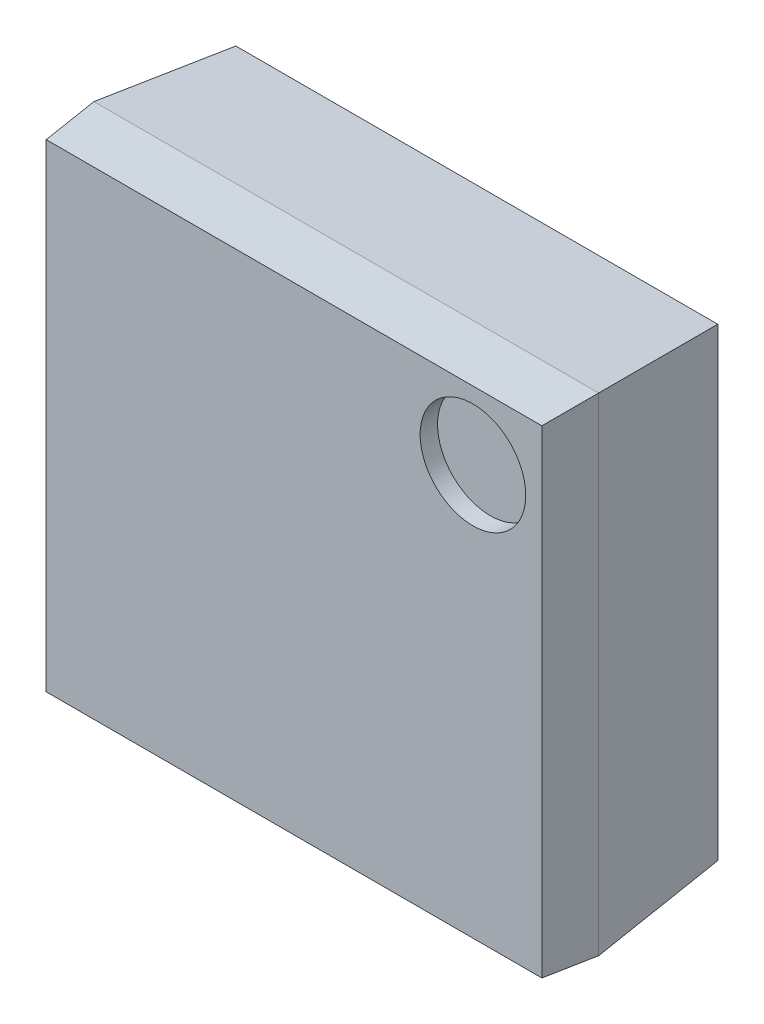
ISO-10303-21;
HEADER;
FILE_DESCRIPTION(('STEP AP214'),'2;1');
FILE_NAME('part.step','',(''),(''),'','','');
FILE_SCHEMA(('AUTOMOTIVE_DESIGN { 1 0 10303 214 1 1 1 1 }'));
ENDSEC;
DATA;
#1=APPLICATION_CONTEXT('core data for automotive mechanical design processes');
#2=APPLICATION_PROTOCOL_DEFINITION('international standard','automotive_design',2000,#1);
#3=PRODUCT_CONTEXT('',#1,'mechanical');
#4=PRODUCT('Part','Part','',(#3));
#5=PRODUCT_RELATED_PRODUCT_CATEGORY('part','',(#4));
#6=PRODUCT_DEFINITION_FORMATION('','',#4);
#7=PRODUCT_DEFINITION_CONTEXT('part definition',#1,'design');
#8=PRODUCT_DEFINITION('design','',#6,#7);
#9=PRODUCT_DEFINITION_SHAPE('','',#8);
#10=(LENGTH_UNIT() NAMED_UNIT(*) SI_UNIT(.MILLI.,.METRE.));
#11=(NAMED_UNIT(*) PLANE_ANGLE_UNIT() SI_UNIT($,.RADIAN.));
#12=(NAMED_UNIT(*) SI_UNIT($,.STERADIAN.) SOLID_ANGLE_UNIT());
#13=UNCERTAINTY_MEASURE_WITH_UNIT(LENGTH_MEASURE(1.E-05),#10,'distance_accuracy_value','');
#14=(GEOMETRIC_REPRESENTATION_CONTEXT(3) GLOBAL_UNCERTAINTY_ASSIGNED_CONTEXT((#13)) GLOBAL_UNIT_ASSIGNED_CONTEXT((#10,
#11,#12)) REPRESENTATION_CONTEXT('',''));
#15=CARTESIAN_POINT('',(0.,0.,0.));
#16=DIRECTION('',(0.,0.,1.));
#17=DIRECTION('',(1.,0.,0.));
#18=AXIS2_PLACEMENT_3D('',#15,#16,#17);
#19=CARTESIAN_POINT('',(1.027786698128,0.981448797763,1.));
#20=DIRECTION('',(0.,0.,1.));
#21=DIRECTION('',(1.,0.,0.));
#22=AXIS2_PLACEMENT_3D('',#19,#20,#21);
#23=PLANE('',#22);
#24=CARTESIAN_POINT('',(1.027786698128,0.981448797763,1.));
#25=DIRECTION('',(0.,0.,1.));
#26=DIRECTION('',(1.,0.,0.));
#27=AXIS2_PLACEMENT_3D('',#24,#25,#26);
#28=CIRCLE('',#27,0.303375309335);
#29=CARTESIAN_POINT('',(1.331162007463,0.981448797763,1.));
#30=VERTEX_POINT('',#29);
#31=EDGE_CURVE('E11',#30,#30,#28,.T.);
#32=ORIENTED_EDGE('',*,*,#31,.T.);
#33=EDGE_LOOP('',(#32));
#34=FACE_BOUND('',#33,.T.);
#35=ADVANCED_FACE('F17',(#34),#23,.T.);
#36=CARTESIAN_POINT('',(1.027786698128,0.981448797763,1.));
#37=DIRECTION('',(0.,0.,1.));
#38=DIRECTION('',(1.,0.,0.));
#39=AXIS2_PLACEMENT_3D('',#36,#37,#38);
#40=CYLINDRICAL_SURFACE('',#39,0.303375309335);
#41=CARTESIAN_POINT('',(1.331162007463,0.981448797763,1.));
#42=CARTESIAN_POINT('',(1.331162007463,0.981448797763,1.1));
#43=(BOUNDED_CURVE() B_SPLINE_CURVE(1,(#41,#42),.UNSPECIFIED.,.F.,
.F.) B_SPLINE_CURVE_WITH_KNOTS((2,2),(0.,0.1),
.UNSPECIFIED.) CURVE() GEOMETRIC_REPRESENTATION_ITEM() RATIONAL_B_SPLINE_CURVE((1.,1.)) REPRESENTATION_ITEM(''));
#44=CARTESIAN_POINT('',(1.331162007463,0.981448797763,1.1));
#45=VERTEX_POINT('',#44);
#46=EDGE_CURVE('E28',#30,#45,#43,.T.);
#47=ORIENTED_EDGE('',*,*,#46,.T.);
#48=CARTESIAN_POINT('',(1.027786698128,0.981448797763,1.1));
#49=DIRECTION('',(0.,0.,1.));
#50=DIRECTION('',(1.,0.,0.));
#51=AXIS2_PLACEMENT_3D('',#48,#49,#50);
#52=CIRCLE('',#51,0.303375309335);
#53=EDGE_CURVE('E100',#45,#45,#52,.T.);
#54=ORIENTED_EDGE('',*,*,#53,.T.);
#55=ORIENTED_EDGE('',*,*,#46,.F.);
#56=ORIENTED_EDGE('',*,*,#31,.F.);
#57=EDGE_LOOP('',(#47,#54,#55,#56));
#58=FACE_BOUND('',#57,.T.);
#59=ADVANCED_FACE('F202',(#58),#40,.F.);
#60=CARTESIAN_POINT('',(0.,0.,1.1));
#61=DIRECTION('',(0.,0.,1.));
#62=DIRECTION('',(1.,0.,0.));
#63=AXIS2_PLACEMENT_3D('',#60,#61,#62);
#64=PLANE('',#63);
#65=DIRECTION('',(1.,0.,0.));
#66=VECTOR('',#65,1.);
#67=CARTESIAN_POINT('',(1.45,-1.373753400942,1.1));
#68=LINE('',#67,#66);
#69=CARTESIAN_POINT('',(-1.423753400942,-1.373753400942,1.1));
#70=VERTEX_POINT('',#69);
#71=CARTESIAN_POINT('',(1.423753400942,-1.373753400942,1.1));
#72=VERTEX_POINT('',#71);
#73=EDGE_CURVE('E101',#70,#72,#68,.T.);
#74=ORIENTED_EDGE('',*,*,#73,.T.);
#75=DIRECTION('',(0.,1.,0.));
#76=VECTOR('',#75,1.);
#77=CARTESIAN_POINT('',(1.423753400942,1.4,1.1));
#78=LINE('',#77,#76);
#79=CARTESIAN_POINT('',(1.423753400942,1.373753400942,1.1));
#80=VERTEX_POINT('',#79);
#81=EDGE_CURVE('E108',#72,#80,#78,.T.);
#82=ORIENTED_EDGE('',*,*,#81,.T.);
#83=DIRECTION('',(-1.,0.,0.));
#84=VECTOR('',#83,1.);
#85=CARTESIAN_POINT('',(-1.45,1.373753400942,1.1));
#86=LINE('',#85,#84);
#87=CARTESIAN_POINT('',(-1.423753400942,1.373753400942,1.1));
#88=VERTEX_POINT('',#87);
#89=EDGE_CURVE('E104',#80,#88,#86,.T.);
#90=ORIENTED_EDGE('',*,*,#89,.T.);
#91=DIRECTION('',(0.,-1.,0.));
#92=VECTOR('',#91,1.);
#93=CARTESIAN_POINT('',(-1.423753400942,-1.4,1.1));
#94=LINE('',#93,#92);
#95=EDGE_CURVE('E87',#88,#70,#94,.T.);
#96=ORIENTED_EDGE('',*,*,#95,.T.);
#97=EDGE_LOOP('',(#74,#82,#90,#96));
#98=FACE_BOUND('',#97,.T.);
#99=ORIENTED_EDGE('',*,*,#53,.F.);
#100=EDGE_LOOP('',(#99));
#101=FACE_BOUND('',#100,.T.);
#102=ADVANCED_FACE('F105',(#98,#101),#64,.T.);
#103=CARTESIAN_POINT('',(0.,0.,0.05));
#104=DIRECTION('',(0.,0.,1.));
#105=DIRECTION('',(1.,0.,0.));
#106=AXIS2_PLACEMENT_3D('',#103,#104,#105);
#107=PLANE('',#106);
#108=DIRECTION('',(1.,0.,0.));
#109=VECTOR('',#108,1.);
#110=CARTESIAN_POINT('',(0.,1.334383502356,0.05));
#111=LINE('',#110,#109);
#112=CARTESIAN_POINT('',(-1.384383502356,1.334383502356,0.05));
#113=VERTEX_POINT('',#112);
#114=CARTESIAN_POINT('',(1.384383502356,1.334383502356,0.05));
#115=VERTEX_POINT('',#114);
#116=EDGE_CURVE('E155',#113,#115,#111,.T.);
#117=ORIENTED_EDGE('',*,*,#116,.T.);
#118=DIRECTION('',(0.,-1.,0.));
#119=VECTOR('',#118,1.);
#120=CARTESIAN_POINT('',(1.384383502356,0.,0.05));
#121=LINE('',#120,#119);
#122=CARTESIAN_POINT('',(1.384383502356,-1.334383502356,0.05));
#123=VERTEX_POINT('',#122);
#124=EDGE_CURVE('E140',#115,#123,#121,.T.);
#125=ORIENTED_EDGE('',*,*,#124,.T.);
#126=DIRECTION('',(-1.,0.,0.));
#127=VECTOR('',#126,1.);
#128=CARTESIAN_POINT('',(0.,-1.334383502356,0.05));
#129=LINE('',#128,#127);
#130=CARTESIAN_POINT('',(-1.384383502356,-1.334383502356,0.05));
#131=VERTEX_POINT('',#130);
#132=EDGE_CURVE('E141',#123,#131,#129,.T.);
#133=ORIENTED_EDGE('',*,*,#132,.T.);
#134=DIRECTION('',(0.,1.,0.));
#135=VECTOR('',#134,1.);
#136=CARTESIAN_POINT('',(-1.384383502356,0.,0.05));
#137=LINE('',#136,#135);
#138=EDGE_CURVE('E135',#131,#113,#137,.T.);
#139=ORIENTED_EDGE('',*,*,#138,.T.);
#140=EDGE_LOOP('',(#117,#125,#133,#139));
#141=FACE_BOUND('',#140,.T.);
#142=ADVANCED_FACE('F205',(#141),#107,.F.);
#143=CARTESIAN_POINT('',(-1.423753400942,0.,1.1));
#144=DIRECTION('',(-0.996194698091747,0.,0.0871557427476379));
#145=DIRECTION('',(0.,1.,0.));
#146=AXIS2_PLACEMENT_3D('',#143,#144,#145);
#147=PLANE('',#146);
#148=DIRECTION('',(0.0868265938642472,-0.0868265938642372,0.992432509138968));
#149=VECTOR('',#148,1.);
#150=CARTESIAN_POINT('',(-1.413396869947,1.363396869947,1.218375690952));
#151=LINE('',#150,#149);
#152=CARTESIAN_POINT('',(-1.45,1.4,0.8));
#153=VERTEX_POINT('',#152);
#154=EDGE_CURVE('E96',#153,#88,#151,.T.);
#155=ORIENTED_EDGE('',*,*,#154,.F.);
#156=DIRECTION('',(0.,1.,0.));
#157=VECTOR('',#156,1.);
#158=CARTESIAN_POINT('',(-1.45,1.4,0.8));
#159=LINE('',#158,#157);
#160=CARTESIAN_POINT('',(-1.45,-1.4,0.8));
#161=VERTEX_POINT('',#160);
#162=EDGE_CURVE('E131',#161,#153,#159,.T.);
#163=ORIENTED_EDGE('',*,*,#162,.F.);
#164=DIRECTION('',(-0.0868265938642373,-0.0868265938642373,-0.992432509138969));
#165=VECTOR('',#164,1.);
#166=CARTESIAN_POINT('',(-1.413019927077,-1.363019927077,1.222684167672));
#167=LINE('',#166,#165);
#168=EDGE_CURVE('E98',#70,#161,#167,.T.);
#169=ORIENTED_EDGE('',*,*,#168,.F.);
#170=ORIENTED_EDGE('',*,*,#95,.F.);
#171=EDGE_LOOP('',(#155,#163,#169,#170));
#172=FACE_BOUND('',#171,.T.);
#173=ADVANCED_FACE('F93',(#172),#147,.T.);
#174=CARTESIAN_POINT('',(0.,-1.373753400942,1.1));
#175=DIRECTION('',(0.,-0.996194698091747,0.0871557427476379));
#176=DIRECTION('',(-1.,0.,0.));
#177=AXIS2_PLACEMENT_3D('',#174,#175,#176);
#178=PLANE('',#177);
#179=ORIENTED_EDGE('',*,*,#168,.T.);
#180=DIRECTION('',(-1.,0.,0.));
#181=VECTOR('',#180,1.);
#182=CARTESIAN_POINT('',(-1.45,-1.4,0.8));
#183=LINE('',#182,#181);
#184=CARTESIAN_POINT('',(1.45,-1.4,0.8));
#185=VERTEX_POINT('',#184);
#186=EDGE_CURVE('E144',#185,#161,#183,.T.);
#187=ORIENTED_EDGE('',*,*,#186,.F.);
#188=DIRECTION('',(0.0868265938642372,-0.0868265938642472,-0.992432509138968));
#189=VECTOR('',#188,1.);
#190=CARTESIAN_POINT('',(1.413019927077,-1.363019927077,1.222684167672));
#191=LINE('',#190,#189);
#192=EDGE_CURVE('E134',#72,#185,#191,.T.);
#193=ORIENTED_EDGE('',*,*,#192,.F.);
#194=ORIENTED_EDGE('',*,*,#73,.F.);
#195=EDGE_LOOP('',(#179,#187,#193,#194));
#196=FACE_BOUND('',#195,.T.);
#197=ADVANCED_FACE('F223',(#196),#178,.T.);
#198=CARTESIAN_POINT('',(0.,1.373753400942,1.1));
#199=DIRECTION('',(0.,0.996194698091747,0.0871557427476379));
#200=DIRECTION('',(1.,0.,0.));
#201=AXIS2_PLACEMENT_3D('',#198,#199,#200);
#202=PLANE('',#201);
#203=ORIENTED_EDGE('',*,*,#154,.T.);
#204=ORIENTED_EDGE('',*,*,#89,.F.);
#205=DIRECTION('',(-0.0868265938642373,-0.0868265938642373,0.992432509138969));
#206=VECTOR('',#205,1.);
#207=CARTESIAN_POINT('',(1.413019927077,1.363019927077,1.222684167672));
#208=LINE('',#207,#206);
#209=CARTESIAN_POINT('',(1.45,1.4,0.8));
#210=VERTEX_POINT('',#209);
#211=EDGE_CURVE('E21',#210,#80,#208,.T.);
#212=ORIENTED_EDGE('',*,*,#211,.F.);
#213=DIRECTION('',(1.,0.,0.));
#214=VECTOR('',#213,1.);
#215=CARTESIAN_POINT('',(1.45,1.4,0.8));
#216=LINE('',#215,#214);
#217=EDGE_CURVE('E116',#153,#210,#216,.T.);
#218=ORIENTED_EDGE('',*,*,#217,.F.);
#219=EDGE_LOOP('',(#203,#204,#212,#218));
#220=FACE_BOUND('',#219,.T.);
#221=ADVANCED_FACE('F114',(#220),#202,.T.);
#222=CARTESIAN_POINT('',(1.423753400942,0.,1.1));
#223=DIRECTION('',(0.996194698091747,0.,0.0871557427476379));
#224=DIRECTION('',(0.,-1.,0.));
#225=AXIS2_PLACEMENT_3D('',#222,#223,#224);
#226=PLANE('',#225);
#227=ORIENTED_EDGE('',*,*,#192,.T.);
#228=DIRECTION('',(0.,-1.,0.));
#229=VECTOR('',#228,1.);
#230=CARTESIAN_POINT('',(1.45,-1.4,0.8));
#231=LINE('',#230,#229);
#232=EDGE_CURVE('E139',#210,#185,#231,.T.);
#233=ORIENTED_EDGE('',*,*,#232,.F.);
#234=ORIENTED_EDGE('',*,*,#211,.T.);
#235=ORIENTED_EDGE('',*,*,#81,.F.);
#236=EDGE_LOOP('',(#227,#233,#234,#235));
#237=FACE_BOUND('',#236,.T.);
#238=ADVANCED_FACE('F222',(#237),#226,.T.);
#239=CARTESIAN_POINT('',(-1.45,1.4,0.8));
#240=DIRECTION('',(0.996194698091748,0.,0.087155742747628));
#241=DIRECTION('',(0.,-1.,0.));
#242=AXIS2_PLACEMENT_3D('',#239,#240,#241);
#243=PLANE('',#242);
#244=DIRECTION('',(-0.0868265938642373,0.0868265938642373,0.992432509138969));
#245=VECTOR('',#244,1.);
#246=CARTESIAN_POINT('',(-1.45,1.4,0.8));
#247=LINE('',#246,#245);
#248=EDGE_CURVE('E171',#113,#153,#247,.T.);
#249=ORIENTED_EDGE('',*,*,#248,.F.);
#250=ORIENTED_EDGE('',*,*,#138,.F.);
#251=DIRECTION('',(0.0868265938642373,0.0868265938642373,-0.992432509138969));
#252=VECTOR('',#251,1.);
#253=CARTESIAN_POINT('',(-1.45,-1.4,0.8));
#254=LINE('',#253,#252);
#255=EDGE_CURVE('E145',#161,#131,#254,.T.);
#256=ORIENTED_EDGE('',*,*,#255,.F.);
#257=ORIENTED_EDGE('',*,*,#162,.T.);
#258=EDGE_LOOP('',(#249,#250,#256,#257));
#259=FACE_BOUND('',#258,.T.);
#260=ADVANCED_FACE('F19',(#259),#243,.F.);
#261=CARTESIAN_POINT('',(-1.45,-1.4,0.8));
#262=DIRECTION('',(0.,0.996194698091748,0.087155742747628));
#263=DIRECTION('',(1.,0.,0.));
#264=AXIS2_PLACEMENT_3D('',#261,#262,#263);
#265=PLANE('',#264);
#266=ORIENTED_EDGE('',*,*,#255,.T.);
#267=ORIENTED_EDGE('',*,*,#132,.F.);
#268=DIRECTION('',(-0.0868265938642373,0.0868265938642373,-0.992432509138969));
#269=VECTOR('',#268,1.);
#270=CARTESIAN_POINT('',(1.428137313534,-1.378137313534,0.550108350215));
#271=LINE('',#270,#269);
#272=EDGE_CURVE('E168',#185,#123,#271,.T.);
#273=ORIENTED_EDGE('',*,*,#272,.F.);
#274=ORIENTED_EDGE('',*,*,#186,.T.);
#275=EDGE_LOOP('',(#266,#267,#273,#274));
#276=FACE_BOUND('',#275,.T.);
#277=ADVANCED_FACE('F231',(#276),#265,.F.);
#278=CARTESIAN_POINT('',(-1.45,1.4,0.8));
#279=DIRECTION('',(0.,-0.996194698091747,0.0871557427476379));
#280=DIRECTION('',(-1.,0.,0.));
#281=AXIS2_PLACEMENT_3D('',#278,#279,#280);
#282=PLANE('',#281);
#283=ORIENTED_EDGE('',*,*,#248,.T.);
#284=ORIENTED_EDGE('',*,*,#217,.T.);
#285=DIRECTION('',(0.0868265938642373,0.0868265938642373,0.992432509138969));
#286=VECTOR('',#285,1.);
#287=CARTESIAN_POINT('',(1.428137313534,1.378137313534,0.550108350215));
#288=LINE('',#287,#286);
#289=EDGE_CURVE('E136',#115,#210,#288,.T.);
#290=ORIENTED_EDGE('',*,*,#289,.F.);
#291=ORIENTED_EDGE('',*,*,#116,.F.);
#292=EDGE_LOOP('',(#283,#284,#290,#291));
#293=FACE_BOUND('',#292,.T.);
#294=ADVANCED_FACE('F227',(#293),#282,.F.);
#295=CARTESIAN_POINT('',(1.45,1.4,0.8));
#296=DIRECTION('',(-0.996194698091747,0.,0.0871557427476379));
#297=DIRECTION('',(0.,1.,0.));
#298=AXIS2_PLACEMENT_3D('',#295,#296,#297);
#299=PLANE('',#298);
#300=ORIENTED_EDGE('',*,*,#272,.T.);
#301=ORIENTED_EDGE('',*,*,#124,.F.);
#302=ORIENTED_EDGE('',*,*,#289,.T.);
#303=ORIENTED_EDGE('',*,*,#232,.T.);
#304=EDGE_LOOP('',(#300,#301,#302,#303));
#305=FACE_BOUND('',#304,.T.);
#306=ADVANCED_FACE('F224',(#305),#299,.F.);
#307=CLOSED_SHELL('',(#35,#59,#102,#142,#173,#197,#221,#238,#260,#277,#294,#306));
#308=MANIFOLD_SOLID_BREP('B1',#307);
#309=ADVANCED_BREP_SHAPE_REPRESENTATION('',(#18,#308),#14);
#310=SHAPE_DEFINITION_REPRESENTATION(#9,#309);
ENDSEC;
END-ISO-10303-21;
